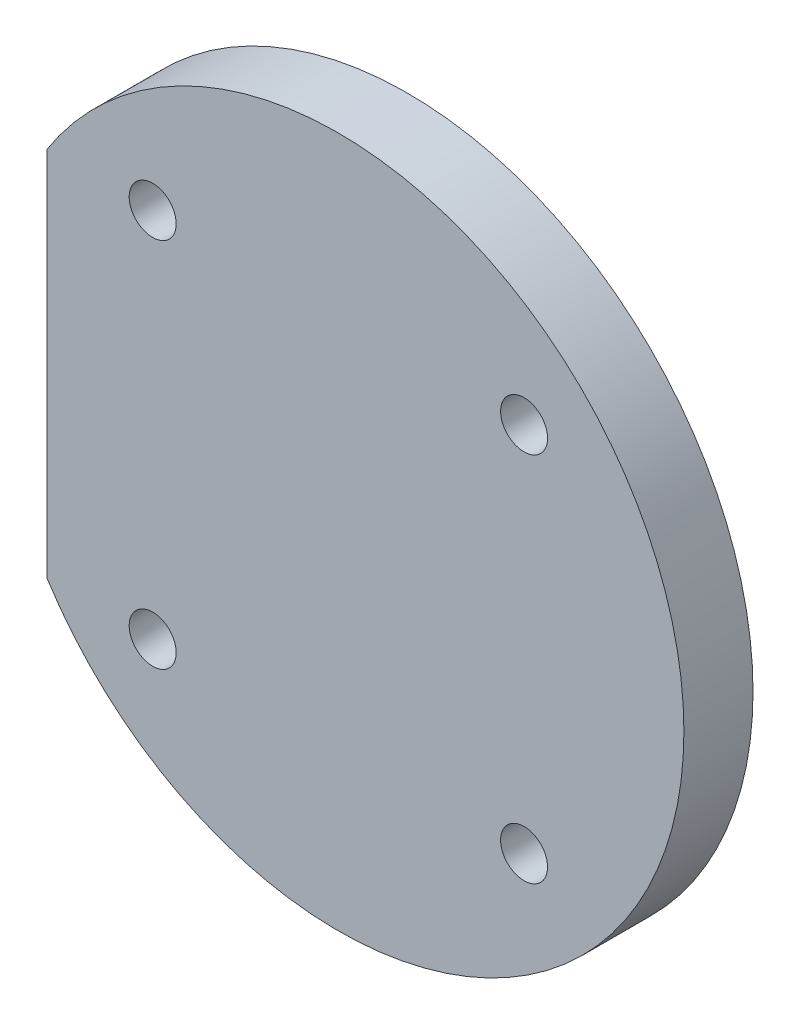
ISO-10303-21;
HEADER;
FILE_DESCRIPTION(('STEP AP214'),'2;1');
FILE_NAME('part.step','',(''),(''),'','','');
FILE_SCHEMA(('AUTOMOTIVE_DESIGN { 1 0 10303 214 1 1 1 1 }'));
ENDSEC;
DATA;
#1=APPLICATION_CONTEXT('core data for automotive mechanical design processes');
#2=APPLICATION_PROTOCOL_DEFINITION('international standard','automotive_design',2000,#1);
#3=PRODUCT_CONTEXT('',#1,'mechanical');
#4=PRODUCT('Part','Part','',(#3));
#5=PRODUCT_RELATED_PRODUCT_CATEGORY('part','',(#4));
#6=PRODUCT_DEFINITION_FORMATION('','',#4);
#7=PRODUCT_DEFINITION_CONTEXT('part definition',#1,'design');
#8=PRODUCT_DEFINITION('design','',#6,#7);
#9=PRODUCT_DEFINITION_SHAPE('','',#8);
#10=(LENGTH_UNIT() NAMED_UNIT(*) SI_UNIT(.MILLI.,.METRE.));
#11=(NAMED_UNIT(*) PLANE_ANGLE_UNIT() SI_UNIT($,.RADIAN.));
#12=(NAMED_UNIT(*) SI_UNIT($,.STERADIAN.) SOLID_ANGLE_UNIT());
#13=UNCERTAINTY_MEASURE_WITH_UNIT(LENGTH_MEASURE(1.E-05),#10,'distance_accuracy_value','');
#14=(GEOMETRIC_REPRESENTATION_CONTEXT(3) GLOBAL_UNCERTAINTY_ASSIGNED_CONTEXT((#13)) GLOBAL_UNIT_ASSIGNED_CONTEXT((#10,
#11,#12)) REPRESENTATION_CONTEXT('',''));
#15=CARTESIAN_POINT('',(0.,0.,0.));
#16=DIRECTION('',(0.,0.,1.));
#17=DIRECTION('',(1.,0.,0.));
#18=AXIS2_PLACEMENT_3D('',#15,#16,#17);
#19=CARTESIAN_POINT('',(0.,0.,-4.));
#20=DIRECTION('',(0.,0.,1.));
#21=DIRECTION('',(1.,0.,0.));
#22=AXIS2_PLACEMENT_3D('',#19,#20,#21);
#23=CYLINDRICAL_SURFACE('',#22,25.);
#24=DIRECTION('',(0.,0.,1.));
#25=VECTOR('',#24,1.);
#26=CARTESIAN_POINT('',(-21.083168642308,13.4350288425444,-4.));
#27=LINE('',#26,#25);
#28=CARTESIAN_POINT('',(-21.083168642308,13.4350288425444,1.));
#29=VERTEX_POINT('',#28);
#30=CARTESIAN_POINT('',(-21.083168642308,13.4350288425444,-4.));
#31=VERTEX_POINT('',#30);
#32=EDGE_CURVE('E63',#29,#31,#27,.F.);
#33=ORIENTED_EDGE('',*,*,#32,.F.);
#34=CARTESIAN_POINT('',(0.,0.,1.));
#35=DIRECTION('',(0.,0.,1.));
#36=DIRECTION('',(1.,0.,0.));
#37=AXIS2_PLACEMENT_3D('',#34,#35,#36);
#38=CIRCLE('',#37,25.);
#39=CARTESIAN_POINT('',(-21.083168642308,-13.4350288425444,1.));
#40=VERTEX_POINT('',#39);
#41=EDGE_CURVE('E72',#40,#29,#38,.T.);
#42=ORIENTED_EDGE('',*,*,#41,.F.);
#43=DIRECTION('',(0.,0.,-1.));
#44=VECTOR('',#43,1.);
#45=CARTESIAN_POINT('',(-21.083168642308,-13.4350288425444,1.));
#46=LINE('',#45,#44);
#47=CARTESIAN_POINT('',(-21.083168642308,-13.4350288425444,-4.));
#48=VERTEX_POINT('',#47);
#49=EDGE_CURVE('E52',#40,#48,#46,.T.);
#50=ORIENTED_EDGE('',*,*,#49,.T.);
#51=CARTESIAN_POINT('',(0.,0.,-4.));
#52=DIRECTION('',(0.,0.,1.));
#53=DIRECTION('',(1.,0.,0.));
#54=AXIS2_PLACEMENT_3D('',#51,#52,#53);
#55=CIRCLE('',#54,25.);
#56=EDGE_CURVE('E46',#48,#31,#55,.T.);
#57=ORIENTED_EDGE('',*,*,#56,.T.);
#58=EDGE_LOOP('',(#33,#42,#50,#57));
#59=FACE_BOUND('',#58,.T.);
#60=ADVANCED_FACE('F38',(#59),#23,.T.);
#61=CARTESIAN_POINT('',(0.,0.,-4.));
#62=DIRECTION('',(0.,0.,1.));
#63=DIRECTION('',(1.,0.,0.));
#64=AXIS2_PLACEMENT_3D('',#61,#62,#63);
#65=PLANE('',#64);
#66=CARTESIAN_POINT('',(-13.4350288425444,-13.4350288425444,-4.));
#67=DIRECTION('',(0.,0.,1.));
#68=DIRECTION('',(1.,0.,0.));
#69=AXIS2_PLACEMENT_3D('',#66,#67,#68);
#70=CIRCLE('',#69,1.7);
#71=CARTESIAN_POINT('',(-11.7350288425444,-13.4350288425444,-4.));
#72=VERTEX_POINT('',#71);
#73=EDGE_CURVE('E90',#72,#72,#70,.T.);
#74=ORIENTED_EDGE('',*,*,#73,.T.);
#75=EDGE_LOOP('',(#74));
#76=FACE_BOUND('',#75,.T.);
#77=CARTESIAN_POINT('',(13.4350288425444,-13.4350288425444,-4.));
#78=DIRECTION('',(0.,0.,1.));
#79=DIRECTION('',(1.,0.,0.));
#80=AXIS2_PLACEMENT_3D('',#77,#78,#79);
#81=CIRCLE('',#80,1.7);
#82=CARTESIAN_POINT('',(15.1350288425444,-13.4350288425444,-4.));
#83=VERTEX_POINT('',#82);
#84=EDGE_CURVE('E86',#83,#83,#81,.T.);
#85=ORIENTED_EDGE('',*,*,#84,.T.);
#86=EDGE_LOOP('',(#85));
#87=FACE_BOUND('',#86,.T.);
#88=CARTESIAN_POINT('',(-13.4350288425444,13.4350288425444,-4.));
#89=DIRECTION('',(0.,0.,1.));
#90=DIRECTION('',(1.,0.,0.));
#91=AXIS2_PLACEMENT_3D('',#88,#89,#90);
#92=CIRCLE('',#91,1.7);
#93=CARTESIAN_POINT('',(-11.7350288425444,13.4350288425444,-4.));
#94=VERTEX_POINT('',#93);
#95=EDGE_CURVE('E80',#94,#94,#92,.T.);
#96=ORIENTED_EDGE('',*,*,#95,.T.);
#97=EDGE_LOOP('',(#96));
#98=FACE_BOUND('',#97,.T.);
#99=CARTESIAN_POINT('',(13.4350288425444,13.4350288425444,-4.));
#100=DIRECTION('',(0.,0.,1.));
#101=DIRECTION('',(1.,0.,0.));
#102=AXIS2_PLACEMENT_3D('',#99,#100,#101);
#103=CIRCLE('',#102,1.7);
#104=CARTESIAN_POINT('',(15.1350288425444,13.4350288425444,-4.));
#105=VERTEX_POINT('',#104);
#106=EDGE_CURVE('E77',#105,#105,#103,.T.);
#107=ORIENTED_EDGE('',*,*,#106,.T.);
#108=EDGE_LOOP('',(#107));
#109=FACE_BOUND('',#108,.T.);
#110=ORIENTED_EDGE('',*,*,#56,.F.);
#111=DIRECTION('',(0.,-1.,0.));
#112=VECTOR('',#111,1.);
#113=CARTESIAN_POINT('',(-21.083168642308,-13.4350288425444,-4.));
#114=LINE('',#113,#112);
#115=EDGE_CURVE('E61',#31,#48,#114,.T.);
#116=ORIENTED_EDGE('',*,*,#115,.F.);
#117=EDGE_LOOP('',(#110,#116));
#118=FACE_BOUND('',#117,.T.);
#119=ADVANCED_FACE('F75',(#76,#87,#98,#109,#118),#65,.F.);
#120=CARTESIAN_POINT('',(13.4350288425444,13.4350288425444,-4.));
#121=DIRECTION('',(0.,0.,1.));
#122=DIRECTION('',(1.,0.,0.));
#123=AXIS2_PLACEMENT_3D('',#120,#121,#122);
#124=CYLINDRICAL_SURFACE('',#123,1.7);
#125=ORIENTED_EDGE('',*,*,#106,.F.);
#126=EDGE_LOOP('',(#125));
#127=FACE_BOUND('',#126,.T.);
#128=CARTESIAN_POINT('',(13.4350288425444,13.4350288425444,1.));
#129=DIRECTION('',(0.,0.,1.));
#130=DIRECTION('',(1.,0.,0.));
#131=AXIS2_PLACEMENT_3D('',#128,#129,#130);
#132=CIRCLE('',#131,1.7);
#133=CARTESIAN_POINT('',(15.1350288425444,13.4350288425444,1.));
#134=VERTEX_POINT('',#133);
#135=EDGE_CURVE('E96',#134,#134,#132,.T.);
#136=ORIENTED_EDGE('',*,*,#135,.T.);
#137=EDGE_LOOP('',(#136));
#138=FACE_BOUND('',#137,.T.);
#139=ADVANCED_FACE('F136',(#127,#138),#124,.F.);
#140=CARTESIAN_POINT('',(-13.4350288425444,13.4350288425444,-4.));
#141=DIRECTION('',(0.,0.,1.));
#142=DIRECTION('',(1.,0.,0.));
#143=AXIS2_PLACEMENT_3D('',#140,#141,#142);
#144=CYLINDRICAL_SURFACE('',#143,1.7);
#145=ORIENTED_EDGE('',*,*,#95,.F.);
#146=EDGE_LOOP('',(#145));
#147=FACE_BOUND('',#146,.T.);
#148=CARTESIAN_POINT('',(-13.4350288425444,13.4350288425444,1.));
#149=DIRECTION('',(0.,0.,1.));
#150=DIRECTION('',(1.,0.,0.));
#151=AXIS2_PLACEMENT_3D('',#148,#149,#150);
#152=CIRCLE('',#151,1.7);
#153=CARTESIAN_POINT('',(-11.7350288425444,13.4350288425444,1.));
#154=VERTEX_POINT('',#153);
#155=EDGE_CURVE('E100',#154,#154,#152,.T.);
#156=ORIENTED_EDGE('',*,*,#155,.T.);
#157=EDGE_LOOP('',(#156));
#158=FACE_BOUND('',#157,.T.);
#159=ADVANCED_FACE('F141',(#147,#158),#144,.F.);
#160=CARTESIAN_POINT('',(13.4350288425444,-13.4350288425444,-4.));
#161=DIRECTION('',(0.,0.,1.));
#162=DIRECTION('',(1.,0.,0.));
#163=AXIS2_PLACEMENT_3D('',#160,#161,#162);
#164=CYLINDRICAL_SURFACE('',#163,1.7);
#165=ORIENTED_EDGE('',*,*,#84,.F.);
#166=EDGE_LOOP('',(#165));
#167=FACE_BOUND('',#166,.T.);
#168=CARTESIAN_POINT('',(13.4350288425444,-13.4350288425444,1.));
#169=DIRECTION('',(0.,0.,1.));
#170=DIRECTION('',(1.,0.,0.));
#171=AXIS2_PLACEMENT_3D('',#168,#169,#170);
#172=CIRCLE('',#171,1.7);
#173=CARTESIAN_POINT('',(15.1350288425444,-13.4350288425444,1.));
#174=VERTEX_POINT('',#173);
#175=EDGE_CURVE('E104',#174,#174,#172,.T.);
#176=ORIENTED_EDGE('',*,*,#175,.T.);
#177=EDGE_LOOP('',(#176));
#178=FACE_BOUND('',#177,.T.);
#179=ADVANCED_FACE('F128',(#167,#178),#164,.F.);
#180=CARTESIAN_POINT('',(-13.4350288425444,-13.4350288425444,-4.));
#181=DIRECTION('',(0.,0.,1.));
#182=DIRECTION('',(1.,0.,0.));
#183=AXIS2_PLACEMENT_3D('',#180,#181,#182);
#184=CYLINDRICAL_SURFACE('',#183,1.7);
#185=ORIENTED_EDGE('',*,*,#73,.F.);
#186=EDGE_LOOP('',(#185));
#187=FACE_BOUND('',#186,.T.);
#188=CARTESIAN_POINT('',(-13.4350288425444,-13.4350288425444,1.));
#189=DIRECTION('',(0.,0.,1.));
#190=DIRECTION('',(1.,0.,0.));
#191=AXIS2_PLACEMENT_3D('',#188,#189,#190);
#192=CIRCLE('',#191,1.7);
#193=CARTESIAN_POINT('',(-11.7350288425444,-13.4350288425444,1.));
#194=VERTEX_POINT('',#193);
#195=EDGE_CURVE('E108',#194,#194,#192,.T.);
#196=ORIENTED_EDGE('',*,*,#195,.T.);
#197=EDGE_LOOP('',(#196));
#198=FACE_BOUND('',#197,.T.);
#199=ADVANCED_FACE('F115',(#187,#198),#184,.F.);
#200=CARTESIAN_POINT('',(0.,0.,1.));
#201=DIRECTION('',(0.,0.,1.));
#202=DIRECTION('',(1.,0.,0.));
#203=AXIS2_PLACEMENT_3D('',#200,#201,#202);
#204=PLANE('',#203);
#205=DIRECTION('',(0.,1.,0.));
#206=VECTOR('',#205,1.);
#207=CARTESIAN_POINT('',(-21.083168642308,0.,1.));
#208=LINE('',#207,#206);
#209=EDGE_CURVE('E11',#40,#29,#208,.T.);
#210=ORIENTED_EDGE('',*,*,#209,.F.);
#211=ORIENTED_EDGE('',*,*,#41,.T.);
#212=EDGE_LOOP('',(#210,#211));
#213=FACE_BOUND('',#212,.T.);
#214=ORIENTED_EDGE('',*,*,#175,.F.);
#215=EDGE_LOOP('',(#214));
#216=FACE_BOUND('',#215,.T.);
#217=ORIENTED_EDGE('',*,*,#135,.F.);
#218=EDGE_LOOP('',(#217));
#219=FACE_BOUND('',#218,.T.);
#220=ORIENTED_EDGE('',*,*,#155,.F.);
#221=EDGE_LOOP('',(#220));
#222=FACE_BOUND('',#221,.T.);
#223=ORIENTED_EDGE('',*,*,#195,.F.);
#224=EDGE_LOOP('',(#223));
#225=FACE_BOUND('',#224,.T.);
#226=ADVANCED_FACE('F117',(#213,#216,#219,#222,#225),#204,.T.);
#227=CARTESIAN_POINT('',(-21.083168642308,-13.4350288425444,1.));
#228=DIRECTION('',(1.,0.,0.));
#229=DIRECTION('',(0.,0.,-1.));
#230=AXIS2_PLACEMENT_3D('',#227,#228,#229);
#231=PLANE('',#230);
#232=ORIENTED_EDGE('',*,*,#32,.T.);
#233=ORIENTED_EDGE('',*,*,#115,.T.);
#234=ORIENTED_EDGE('',*,*,#49,.F.);
#235=ORIENTED_EDGE('',*,*,#209,.T.);
#236=EDGE_LOOP('',(#232,#233,#234,#235));
#237=FACE_BOUND('',#236,.T.);
#238=ADVANCED_FACE('F62',(#237),#231,.F.);
#239=CLOSED_SHELL('',(#60,#119,#139,#159,#179,#199,#226,#238));
#240=MANIFOLD_SOLID_BREP('B2',#239);
#241=ADVANCED_BREP_SHAPE_REPRESENTATION('',(#18,#240),#14);
#242=SHAPE_DEFINITION_REPRESENTATION(#9,#241);
ENDSEC;
END-ISO-10303-21;
